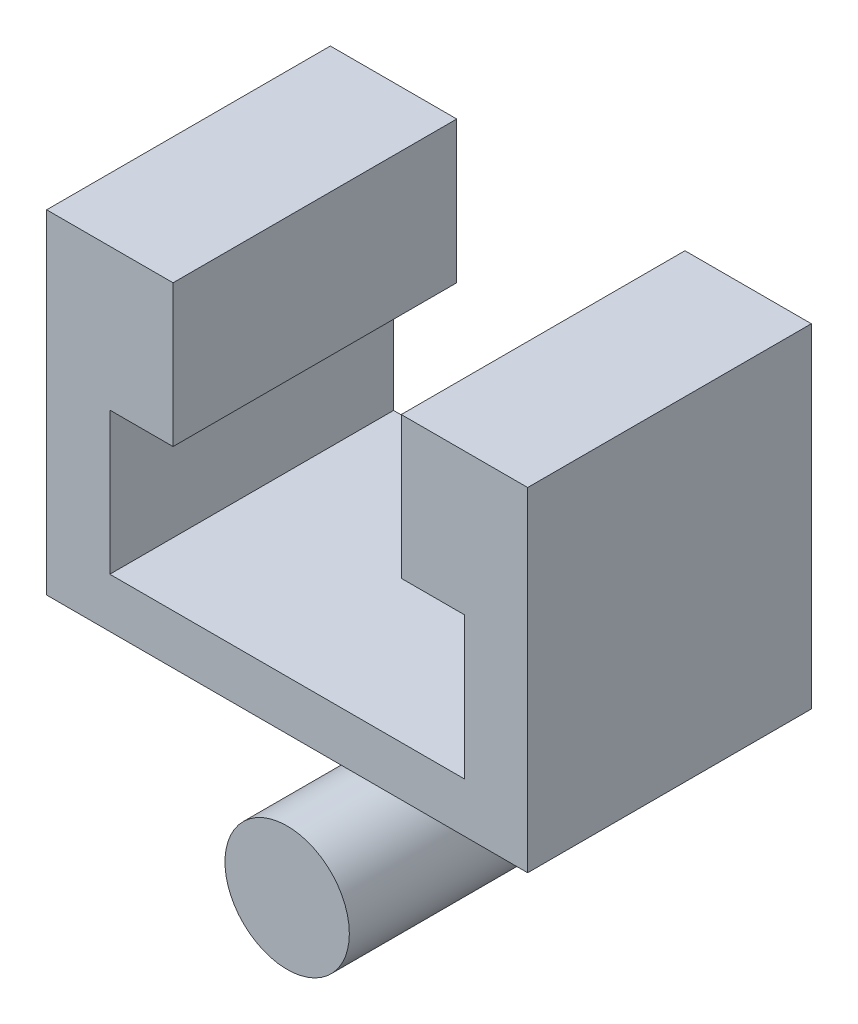
ISO-10303-21;
HEADER;
FILE_DESCRIPTION(('STEP AP214'),'2;1');
FILE_NAME('part.step','',(''),(''),'','','');
FILE_SCHEMA(('AUTOMOTIVE_DESIGN { 1 0 10303 214 1 1 1 1 }'));
ENDSEC;
DATA;
#1=APPLICATION_CONTEXT('core data for automotive mechanical design processes');
#2=APPLICATION_PROTOCOL_DEFINITION('international standard','automotive_design',2000,#1);
#3=PRODUCT_CONTEXT('',#1,'mechanical');
#4=PRODUCT('Part','Part','',(#3));
#5=PRODUCT_RELATED_PRODUCT_CATEGORY('part','',(#4));
#6=PRODUCT_DEFINITION_FORMATION('','',#4);
#7=PRODUCT_DEFINITION_CONTEXT('part definition',#1,'design');
#8=PRODUCT_DEFINITION('design','',#6,#7);
#9=PRODUCT_DEFINITION_SHAPE('','',#8);
#10=(LENGTH_UNIT() NAMED_UNIT(*) SI_UNIT(.MILLI.,.METRE.));
#11=(NAMED_UNIT(*) PLANE_ANGLE_UNIT() SI_UNIT($,.RADIAN.));
#12=(NAMED_UNIT(*) SI_UNIT($,.STERADIAN.) SOLID_ANGLE_UNIT());
#13=UNCERTAINTY_MEASURE_WITH_UNIT(LENGTH_MEASURE(1.E-05),#10,'distance_accuracy_value','');
#14=(GEOMETRIC_REPRESENTATION_CONTEXT(3) GLOBAL_UNCERTAINTY_ASSIGNED_CONTEXT((#13)) GLOBAL_UNIT_ASSIGNED_CONTEXT((#10,
#11,#12)) REPRESENTATION_CONTEXT('',''));
#15=CARTESIAN_POINT('',(0.,0.,0.));
#16=DIRECTION('',(0.,0.,1.));
#17=DIRECTION('',(1.,0.,0.));
#18=AXIS2_PLACEMENT_3D('',#15,#16,#17);
#19=CARTESIAN_POINT('',(43.0685157233723,85.1480723545712,50.8));
#20=DIRECTION('',(0.,-1.,0.));
#21=DIRECTION('',(0.,0.,-1.));
#22=AXIS2_PLACEMENT_3D('',#19,#20,#21);
#23=PLANE('',#22);
#24=DIRECTION('',(0.,0.,1.));
#25=VECTOR('',#24,1.);
#26=CARTESIAN_POINT('',(-20.4314842766277,85.1480723545712,0.));
#27=LINE('',#26,#25);
#28=CARTESIAN_POINT('',(-20.4314842766277,85.1480723545712,0.));
#29=VERTEX_POINT('',#28);
#30=CARTESIAN_POINT('',(-20.4314842766277,85.1480723545712,50.8));
#31=VERTEX_POINT('',#30);
#32=EDGE_CURVE('E169',#29,#31,#27,.T.);
#33=ORIENTED_EDGE('',*,*,#32,.F.);
#34=DIRECTION('',(-1.,0.,0.));
#35=VECTOR('',#34,1.);
#36=CARTESIAN_POINT('',(43.0685157233723,85.1480723545712,0.));
#37=LINE('',#36,#35);
#38=CARTESIAN_POINT('',(-43.0685157233723,85.1480723545712,0.));
#39=VERTEX_POINT('',#38);
#40=EDGE_CURVE('E180',#29,#39,#37,.T.);
#41=ORIENTED_EDGE('',*,*,#40,.T.);
#42=DIRECTION('',(0.,0.,-1.));
#43=VECTOR('',#42,1.);
#44=CARTESIAN_POINT('',(-43.0685157233723,85.1480723545712,50.8));
#45=LINE('',#44,#43);
#46=CARTESIAN_POINT('',(-43.0685157233723,85.1480723545712,50.8));
#47=VERTEX_POINT('',#46);
#48=EDGE_CURVE('E198',#47,#39,#45,.T.);
#49=ORIENTED_EDGE('',*,*,#48,.F.);
#50=DIRECTION('',(-1.,0.,0.));
#51=VECTOR('',#50,1.);
#52=CARTESIAN_POINT('',(43.0685157233723,85.1480723545712,50.8));
#53=LINE('',#52,#51);
#54=EDGE_CURVE('E182',#31,#47,#53,.T.);
#55=ORIENTED_EDGE('',*,*,#54,.F.);
#56=EDGE_LOOP('',(#33,#41,#49,#55));
#57=FACE_BOUND('',#56,.T.);
#58=ADVANCED_FACE('F47',(#57),#23,.F.);
#59=CARTESIAN_POINT('',(0.,0.,0.));
#60=DIRECTION('',(0.,0.,1.));
#61=DIRECTION('',(1.,0.,0.));
#62=AXIS2_PLACEMENT_3D('',#59,#60,#61);
#63=PLANE('',#62);
#64=DIRECTION('',(0.,1.,0.));
#65=VECTOR('',#64,1.);
#66=CARTESIAN_POINT('',(-20.4314842766278,59.7480723545712,0.));
#67=LINE('',#66,#65);
#68=CARTESIAN_POINT('',(-20.4314842766278,59.7480723545712,0.));
#69=VERTEX_POINT('',#68);
#70=EDGE_CURVE('E166',#69,#29,#67,.T.);
#71=ORIENTED_EDGE('',*,*,#70,.F.);
#72=DIRECTION('',(1.,0.,0.));
#73=VECTOR('',#72,1.);
#74=CARTESIAN_POINT('',(-31.75,59.7480723545712,0.));
#75=LINE('',#74,#73);
#76=CARTESIAN_POINT('',(-31.75,59.7480723545712,0.));
#77=VERTEX_POINT('',#76);
#78=EDGE_CURVE('E297',#77,#69,#75,.T.);
#79=ORIENTED_EDGE('',*,*,#78,.F.);
#80=DIRECTION('',(0.,1.,0.));
#81=VECTOR('',#80,1.);
#82=CARTESIAN_POINT('',(-31.75,34.29,0.));
#83=LINE('',#82,#81);
#84=CARTESIAN_POINT('',(-31.75,34.29,0.));
#85=VERTEX_POINT('',#84);
#86=EDGE_CURVE('E295',#85,#77,#83,.T.);
#87=ORIENTED_EDGE('',*,*,#86,.F.);
#88=DIRECTION('',(-1.,0.,0.));
#89=VECTOR('',#88,1.);
#90=CARTESIAN_POINT('',(31.75,34.29,0.));
#91=LINE('',#90,#89);
#92=CARTESIAN_POINT('',(31.75,34.29,0.));
#93=VERTEX_POINT('',#92);
#94=EDGE_CURVE('E293',#93,#85,#91,.T.);
#95=ORIENTED_EDGE('',*,*,#94,.F.);
#96=DIRECTION('',(0.,-1.,0.));
#97=VECTOR('',#96,1.);
#98=CARTESIAN_POINT('',(31.75,59.7480723545712,0.));
#99=LINE('',#98,#97);
#100=CARTESIAN_POINT('',(31.75,59.7480723545712,0.));
#101=VERTEX_POINT('',#100);
#102=EDGE_CURVE('E289',#101,#93,#99,.T.);
#103=ORIENTED_EDGE('',*,*,#102,.F.);
#104=DIRECTION('',(1.,0.,0.));
#105=VECTOR('',#104,1.);
#106=CARTESIAN_POINT('',(20.4314842766277,59.7480723545712,0.));
#107=LINE('',#106,#105);
#108=CARTESIAN_POINT('',(20.4314842766277,59.7480723545712,0.));
#109=VERTEX_POINT('',#108);
#110=EDGE_CURVE('E285',#109,#101,#107,.T.);
#111=ORIENTED_EDGE('',*,*,#110,.F.);
#112=DIRECTION('',(0.,-1.,0.));
#113=VECTOR('',#112,1.);
#114=CARTESIAN_POINT('',(20.4314842766278,85.1480723545712,0.));
#115=LINE('',#114,#113);
#116=CARTESIAN_POINT('',(20.4314842766278,85.1480723545712,0.));
#117=VERTEX_POINT('',#116);
#118=EDGE_CURVE('E174',#117,#109,#115,.T.);
#119=ORIENTED_EDGE('',*,*,#118,.F.);
#120=CARTESIAN_POINT('',(43.0685157233723,85.1480723545712,0.));
#121=VERTEX_POINT('',#120);
#122=EDGE_CURVE('E189',#121,#117,#37,.T.);
#123=ORIENTED_EDGE('',*,*,#122,.F.);
#124=DIRECTION('',(0.,1.,0.));
#125=VECTOR('',#124,1.);
#126=CARTESIAN_POINT('',(43.0685157233722,25.4,0.));
#127=LINE('',#126,#125);
#128=CARTESIAN_POINT('',(43.0685157233722,25.4,0.));
#129=VERTEX_POINT('',#128);
#130=EDGE_CURVE('E190',#129,#121,#127,.T.);
#131=ORIENTED_EDGE('',*,*,#130,.F.);
#132=DIRECTION('',(1.,0.,0.));
#133=VECTOR('',#132,1.);
#134=CARTESIAN_POINT('',(-43.0685157233722,25.4,0.));
#135=LINE('',#134,#133);
#136=CARTESIAN_POINT('',(11.1361185564172,25.4,0.));
#137=VERTEX_POINT('',#136);
#138=EDGE_CURVE('E237',#137,#129,#135,.T.);
#139=ORIENTED_EDGE('',*,*,#138,.F.);
#140=DIRECTION('',(0.,-1.,0.));
#141=VECTOR('',#140,1.);
#142=CARTESIAN_POINT('',(11.1361185564172,25.4,0.));
#143=LINE('',#142,#141);
#144=CARTESIAN_POINT('',(11.1361185564172,0.,0.));
#145=VERTEX_POINT('',#144);
#146=EDGE_CURVE('E214',#137,#145,#143,.T.);
#147=ORIENTED_EDGE('',*,*,#146,.T.);
#148=CARTESIAN_POINT('',(0.,0.,0.));
#149=DIRECTION('',(0.,0.,1.));
#150=DIRECTION('',(1.,0.,0.));
#151=AXIS2_PLACEMENT_3D('',#148,#149,#150);
#152=CIRCLE('',#151,11.1361185564172);
#153=CARTESIAN_POINT('',(-11.1361185564172,0.,0.));
#154=VERTEX_POINT('',#153);
#155=EDGE_CURVE('E210',#154,#145,#152,.T.);
#156=ORIENTED_EDGE('',*,*,#155,.F.);
#157=DIRECTION('',(0.,1.,0.));
#158=VECTOR('',#157,1.);
#159=CARTESIAN_POINT('',(-11.1361185564172,0.,0.));
#160=LINE('',#159,#158);
#161=CARTESIAN_POINT('',(-11.1361185564172,25.4,0.));
#162=VERTEX_POINT('',#161);
#163=EDGE_CURVE('E219',#154,#162,#160,.T.);
#164=ORIENTED_EDGE('',*,*,#163,.T.);
#165=CARTESIAN_POINT('',(-43.0685157233722,25.4,0.));
#166=VERTEX_POINT('',#165);
#167=EDGE_CURVE('E194',#166,#162,#135,.T.);
#168=ORIENTED_EDGE('',*,*,#167,.F.);
#169=DIRECTION('',(0.,-1.,0.));
#170=VECTOR('',#169,1.);
#171=CARTESIAN_POINT('',(-43.0685157233723,85.1480723545712,0.));
#172=LINE('',#171,#170);
#173=EDGE_CURVE('E183',#39,#166,#172,.T.);
#174=ORIENTED_EDGE('',*,*,#173,.F.);
#175=ORIENTED_EDGE('',*,*,#40,.F.);
#176=EDGE_LOOP('',(#71,#79,#87,#95,#103,#111,#119,#123,#131,#139,#147,#156,#164,#168,#174,#175));
#177=FACE_BOUND('',#176,.T.);
#178=ADVANCED_FACE('F187',(#177),#63,.F.);
#179=CARTESIAN_POINT('',(0.,0.,50.8));
#180=DIRECTION('',(0.,0.,1.));
#181=DIRECTION('',(1.,0.,0.));
#182=AXIS2_PLACEMENT_3D('',#179,#180,#181);
#183=PLANE('',#182);
#184=DIRECTION('',(1.,0.,0.));
#185=VECTOR('',#184,1.);
#186=CARTESIAN_POINT('',(-31.75,59.7480723545712,50.8));
#187=LINE('',#186,#185);
#188=CARTESIAN_POINT('',(-31.75,59.7480723545712,50.8));
#189=VERTEX_POINT('',#188);
#190=CARTESIAN_POINT('',(-20.4314842766278,59.7480723545712,50.8));
#191=VERTEX_POINT('',#190);
#192=EDGE_CURVE('E175',#189,#191,#187,.T.);
#193=ORIENTED_EDGE('',*,*,#192,.T.);
#194=DIRECTION('',(0.,1.,0.));
#195=VECTOR('',#194,1.);
#196=CARTESIAN_POINT('',(-20.4314842766278,59.7480723545712,50.8));
#197=LINE('',#196,#195);
#198=EDGE_CURVE('E64',#191,#31,#197,.T.);
#199=ORIENTED_EDGE('',*,*,#198,.T.);
#200=ORIENTED_EDGE('',*,*,#54,.T.);
#201=DIRECTION('',(0.,-1.,0.));
#202=VECTOR('',#201,1.);
#203=CARTESIAN_POINT('',(-43.0685157233723,85.1480723545712,50.8));
#204=LINE('',#203,#202);
#205=CARTESIAN_POINT('',(-43.0685157233722,25.4,50.8));
#206=VERTEX_POINT('',#205);
#207=EDGE_CURVE('E193',#47,#206,#204,.T.);
#208=ORIENTED_EDGE('',*,*,#207,.T.);
#209=DIRECTION('',(1.,0.,0.));
#210=VECTOR('',#209,1.);
#211=CARTESIAN_POINT('',(-43.0685157233722,25.4,50.8));
#212=LINE('',#211,#210);
#213=CARTESIAN_POINT('',(43.0685157233722,25.4,50.8));
#214=VERTEX_POINT('',#213);
#215=EDGE_CURVE('E331',#206,#214,#212,.T.);
#216=ORIENTED_EDGE('',*,*,#215,.T.);
#217=DIRECTION('',(0.,1.,0.));
#218=VECTOR('',#217,1.);
#219=CARTESIAN_POINT('',(43.0685157233722,25.4,50.8));
#220=LINE('',#219,#218);
#221=CARTESIAN_POINT('',(43.0685157233723,85.1480723545712,50.8));
#222=VERTEX_POINT('',#221);
#223=EDGE_CURVE('E333',#214,#222,#220,.T.);
#224=ORIENTED_EDGE('',*,*,#223,.T.);
#225=CARTESIAN_POINT('',(20.4314842766278,85.1480723545712,50.8));
#226=VERTEX_POINT('',#225);
#227=EDGE_CURVE('E201',#222,#226,#53,.T.);
#228=ORIENTED_EDGE('',*,*,#227,.T.);
#229=DIRECTION('',(0.,-1.,0.));
#230=VECTOR('',#229,1.);
#231=CARTESIAN_POINT('',(20.4314842766278,85.1480723545712,50.8));
#232=LINE('',#231,#230);
#233=CARTESIAN_POINT('',(20.4314842766277,59.7480723545712,50.8));
#234=VERTEX_POINT('',#233);
#235=EDGE_CURVE('E300',#226,#234,#232,.T.);
#236=ORIENTED_EDGE('',*,*,#235,.T.);
#237=DIRECTION('',(1.,0.,0.));
#238=VECTOR('',#237,1.);
#239=CARTESIAN_POINT('',(20.4314842766277,59.7480723545712,50.8));
#240=LINE('',#239,#238);
#241=CARTESIAN_POINT('',(31.75,59.7480723545712,50.8));
#242=VERTEX_POINT('',#241);
#243=EDGE_CURVE('E303',#234,#242,#240,.T.);
#244=ORIENTED_EDGE('',*,*,#243,.T.);
#245=DIRECTION('',(0.,-1.,0.));
#246=VECTOR('',#245,1.);
#247=CARTESIAN_POINT('',(31.75,59.7480723545712,50.8));
#248=LINE('',#247,#246);
#249=CARTESIAN_POINT('',(31.75,34.29,50.8));
#250=VERTEX_POINT('',#249);
#251=EDGE_CURVE('E306',#242,#250,#248,.T.);
#252=ORIENTED_EDGE('',*,*,#251,.T.);
#253=DIRECTION('',(-1.,0.,0.));
#254=VECTOR('',#253,1.);
#255=CARTESIAN_POINT('',(31.75,34.29,50.8));
#256=LINE('',#255,#254);
#257=CARTESIAN_POINT('',(-31.75,34.29,50.8));
#258=VERTEX_POINT('',#257);
#259=EDGE_CURVE('E309',#250,#258,#256,.T.);
#260=ORIENTED_EDGE('',*,*,#259,.T.);
#261=DIRECTION('',(0.,1.,0.));
#262=VECTOR('',#261,1.);
#263=CARTESIAN_POINT('',(-31.75,34.29,50.8));
#264=LINE('',#263,#262);
#265=EDGE_CURVE('E312',#258,#189,#264,.T.);
#266=ORIENTED_EDGE('',*,*,#265,.T.);
#267=EDGE_LOOP('',(#193,#199,#200,#208,#216,#224,#228,#236,#244,#252,#260,#266));
#268=FACE_BOUND('',#267,.T.);
#269=ADVANCED_FACE('F261',(#268),#183,.T.);
#270=CARTESIAN_POINT('',(11.1361185564172,25.4,0.840608911943736));
#271=DIRECTION('',(1.,0.,0.));
#272=DIRECTION('',(0.,1.,0.));
#273=AXIS2_PLACEMENT_3D('',#270,#271,#272);
#274=PLANE('',#273);
#275=ORIENTED_EDGE('',*,*,#146,.F.);
#276=DIRECTION('',(0.,0.,-1.));
#277=VECTOR('',#276,1.);
#278=CARTESIAN_POINT('',(11.1361185564172,25.4,0.840608911943736));
#279=LINE('',#278,#277);
#280=CARTESIAN_POINT('',(11.1361185564172,25.4,0.840608911943736));
#281=VERTEX_POINT('',#280);
#282=EDGE_CURVE('E11',#281,#137,#279,.T.);
#283=ORIENTED_EDGE('',*,*,#282,.F.);
#284=DIRECTION('',(0.,-1.,0.));
#285=VECTOR('',#284,1.);
#286=CARTESIAN_POINT('',(11.1361185564172,25.4,0.840608911943736));
#287=LINE('',#286,#285);
#288=CARTESIAN_POINT('',(11.1361185564172,0.,0.840608911943736));
#289=VERTEX_POINT('',#288);
#290=EDGE_CURVE('E217',#281,#289,#287,.T.);
#291=ORIENTED_EDGE('',*,*,#290,.T.);
#292=DIRECTION('',(0.,0.,-1.));
#293=VECTOR('',#292,1.);
#294=CARTESIAN_POINT('',(11.1361185564172,0.,0.840608911943736));
#295=LINE('',#294,#293);
#296=EDGE_CURVE('E51',#289,#145,#295,.T.);
#297=ORIENTED_EDGE('',*,*,#296,.T.);
#298=EDGE_LOOP('',(#275,#283,#291,#297));
#299=FACE_BOUND('',#298,.T.);
#300=ADVANCED_FACE('F49',(#299),#274,.T.);
#301=CARTESIAN_POINT('',(-11.1361185564172,0.,0.840608911943736));
#302=DIRECTION('',(-1.,0.,0.));
#303=DIRECTION('',(0.,-1.,0.));
#304=AXIS2_PLACEMENT_3D('',#301,#302,#303);
#305=PLANE('',#304);
#306=ORIENTED_EDGE('',*,*,#163,.F.);
#307=DIRECTION('',(0.,0.,-1.));
#308=VECTOR('',#307,1.);
#309=CARTESIAN_POINT('',(-11.1361185564172,0.,0.840608911943736));
#310=LINE('',#309,#308);
#311=CARTESIAN_POINT('',(-11.1361185564172,0.,0.840608911943735));
#312=VERTEX_POINT('',#311);
#313=EDGE_CURVE('E229',#312,#154,#310,.T.);
#314=ORIENTED_EDGE('',*,*,#313,.F.);
#315=DIRECTION('',(0.,1.,0.));
#316=VECTOR('',#315,1.);
#317=CARTESIAN_POINT('',(-11.1361185564172,0.,0.840608911943736));
#318=LINE('',#317,#316);
#319=CARTESIAN_POINT('',(-11.1361185564172,25.4,0.840608911943736));
#320=VERTEX_POINT('',#319);
#321=EDGE_CURVE('E221',#312,#320,#318,.T.);
#322=ORIENTED_EDGE('',*,*,#321,.T.);
#323=DIRECTION('',(0.,0.,-1.));
#324=VECTOR('',#323,1.);
#325=CARTESIAN_POINT('',(-11.1361185564172,25.4,0.840608911943736));
#326=LINE('',#325,#324);
#327=EDGE_CURVE('E56',#320,#162,#326,.T.);
#328=ORIENTED_EDGE('',*,*,#327,.T.);
#329=EDGE_LOOP('',(#306,#314,#322,#328));
#330=FACE_BOUND('',#329,.T.);
#331=ADVANCED_FACE('F374',(#330),#305,.T.);
#332=CARTESIAN_POINT('',(0.,0.,0.840608911943736));
#333=DIRECTION('',(0.,0.,1.));
#334=DIRECTION('',(1.,0.,0.));
#335=AXIS2_PLACEMENT_3D('',#332,#333,#334);
#336=PLANE('',#335);
#337=ORIENTED_EDGE('',*,*,#290,.F.);
#338=DIRECTION('',(1.,0.,0.));
#339=VECTOR('',#338,1.);
#340=CARTESIAN_POINT('',(-11.1361185564172,25.4,0.840608911943736));
#341=LINE('',#340,#339);
#342=EDGE_CURVE('E223',#320,#281,#341,.T.);
#343=ORIENTED_EDGE('',*,*,#342,.F.);
#344=ORIENTED_EDGE('',*,*,#321,.F.);
#345=CARTESIAN_POINT('',(0.,0.,0.840608911943736));
#346=DIRECTION('',(0.,0.,1.));
#347=DIRECTION('',(1.,0.,0.));
#348=AXIS2_PLACEMENT_3D('',#345,#346,#347);
#349=CIRCLE('',#348,11.1361185564172);
#350=EDGE_CURVE('E93',#289,#312,#349,.T.);
#351=ORIENTED_EDGE('',*,*,#350,.F.);
#352=EDGE_LOOP('',(#337,#343,#344,#351));
#353=FACE_BOUND('',#352,.T.);
#354=ADVANCED_FACE('F242',(#353),#336,.T.);
#355=CARTESIAN_POINT('',(0.,0.,50.8));
#356=DIRECTION('',(0.,0.,-1.));
#357=DIRECTION('',(-1.,0.,0.));
#358=AXIS2_PLACEMENT_3D('',#355,#356,#357);
#359=CYLINDRICAL_SURFACE('',#358,11.1361185564172);
#360=ORIENTED_EDGE('',*,*,#296,.F.);
#361=ORIENTED_EDGE('',*,*,#350,.T.);
#362=ORIENTED_EDGE('',*,*,#313,.T.);
#363=ORIENTED_EDGE('',*,*,#155,.T.);
#364=EDGE_LOOP('',(#360,#361,#362,#363));
#365=FACE_BOUND('',#364,.T.);
#366=CARTESIAN_POINT('',(0.,0.,50.8));
#367=DIRECTION('',(0.,0.,1.));
#368=DIRECTION('',(1.,0.,0.));
#369=AXIS2_PLACEMENT_3D('',#366,#367,#368);
#370=CIRCLE('',#369,11.1361185564172);
#371=CARTESIAN_POINT('',(11.1361185564172,0.,50.8));
#372=VERTEX_POINT('',#371);
#373=EDGE_CURVE('E211',#372,#372,#370,.T.);
#374=ORIENTED_EDGE('',*,*,#373,.F.);
#375=EDGE_LOOP('',(#374));
#376=FACE_BOUND('',#375,.T.);
#377=ADVANCED_FACE('F238',(#365,#376),#359,.T.);
#378=CARTESIAN_POINT('',(0.,0.,50.8));
#379=DIRECTION('',(0.,0.,1.));
#380=DIRECTION('',(1.,0.,0.));
#381=AXIS2_PLACEMENT_3D('',#378,#379,#380);
#382=PLANE('',#381);
#383=ORIENTED_EDGE('',*,*,#373,.T.);
#384=EDGE_LOOP('',(#383));
#385=FACE_BOUND('',#384,.T.);
#386=ADVANCED_FACE('F241',(#385),#382,.T.);
#387=CARTESIAN_POINT('',(-43.0685157233723,85.1480723545712,50.8));
#388=DIRECTION('',(1.,0.,0.));
#389=DIRECTION('',(0.,1.,0.));
#390=AXIS2_PLACEMENT_3D('',#387,#388,#389);
#391=PLANE('',#390);
#392=ORIENTED_EDGE('',*,*,#173,.T.);
#393=DIRECTION('',(0.,0.,-1.));
#394=VECTOR('',#393,1.);
#395=CARTESIAN_POINT('',(-43.0685157233722,25.4,50.8));
#396=LINE('',#395,#394);
#397=EDGE_CURVE('E207',#206,#166,#396,.T.);
#398=ORIENTED_EDGE('',*,*,#397,.F.);
#399=ORIENTED_EDGE('',*,*,#207,.F.);
#400=ORIENTED_EDGE('',*,*,#48,.T.);
#401=EDGE_LOOP('',(#392,#398,#399,#400));
#402=FACE_BOUND('',#401,.T.);
#403=ADVANCED_FACE('F247',(#402),#391,.F.);
#404=CARTESIAN_POINT('',(-43.0685157233722,25.4,50.8));
#405=DIRECTION('',(0.,1.,0.));
#406=DIRECTION('',(0.,0.,1.));
#407=AXIS2_PLACEMENT_3D('',#404,#405,#406);
#408=PLANE('',#407);
#409=ORIENTED_EDGE('',*,*,#327,.F.);
#410=ORIENTED_EDGE('',*,*,#342,.T.);
#411=ORIENTED_EDGE('',*,*,#282,.T.);
#412=ORIENTED_EDGE('',*,*,#138,.T.);
#413=DIRECTION('',(0.,0.,-1.));
#414=VECTOR('',#413,1.);
#415=CARTESIAN_POINT('',(43.0685157233722,25.4,50.8));
#416=LINE('',#415,#414);
#417=EDGE_CURVE('E204',#214,#129,#416,.T.);
#418=ORIENTED_EDGE('',*,*,#417,.F.);
#419=ORIENTED_EDGE('',*,*,#215,.F.);
#420=ORIENTED_EDGE('',*,*,#397,.T.);
#421=ORIENTED_EDGE('',*,*,#167,.T.);
#422=EDGE_LOOP('',(#409,#410,#411,#412,#418,#419,#420,#421));
#423=FACE_BOUND('',#422,.T.);
#424=ADVANCED_FACE('F251',(#423),#408,.F.);
#425=CARTESIAN_POINT('',(43.0685157233722,25.4,50.8));
#426=DIRECTION('',(-1.,0.,0.));
#427=DIRECTION('',(0.,-1.,0.));
#428=AXIS2_PLACEMENT_3D('',#425,#426,#427);
#429=PLANE('',#428);
#430=ORIENTED_EDGE('',*,*,#130,.T.);
#431=DIRECTION('',(0.,0.,-1.));
#432=VECTOR('',#431,1.);
#433=CARTESIAN_POINT('',(43.0685157233723,85.1480723545712,50.8));
#434=LINE('',#433,#432);
#435=EDGE_CURVE('E200',#222,#121,#434,.T.);
#436=ORIENTED_EDGE('',*,*,#435,.F.);
#437=ORIENTED_EDGE('',*,*,#223,.F.);
#438=ORIENTED_EDGE('',*,*,#417,.T.);
#439=EDGE_LOOP('',(#430,#436,#437,#438));
#440=FACE_BOUND('',#439,.T.);
#441=ADVANCED_FACE('F266',(#440),#429,.F.);
#442=ORIENTED_EDGE('',*,*,#122,.T.);
#443=DIRECTION('',(0.,0.,1.));
#444=VECTOR('',#443,1.);
#445=CARTESIAN_POINT('',(20.4314842766278,85.1480723545712,0.));
#446=LINE('',#445,#444);
#447=EDGE_CURVE('E184',#117,#226,#446,.T.);
#448=ORIENTED_EDGE('',*,*,#447,.T.);
#449=ORIENTED_EDGE('',*,*,#227,.F.);
#450=ORIENTED_EDGE('',*,*,#435,.T.);
#451=EDGE_LOOP('',(#442,#448,#449,#450));
#452=FACE_BOUND('',#451,.T.);
#453=ADVANCED_FACE('F256',(#452),#23,.F.);
#454=CARTESIAN_POINT('',(-20.4314842766278,59.7480723545712,0.));
#455=DIRECTION('',(1.,0.,0.));
#456=DIRECTION('',(0.,1.,0.));
#457=AXIS2_PLACEMENT_3D('',#454,#455,#456);
#458=PLANE('',#457);
#459=ORIENTED_EDGE('',*,*,#198,.F.);
#460=DIRECTION('',(0.,0.,1.));
#461=VECTOR('',#460,1.);
#462=CARTESIAN_POINT('',(-20.4314842766278,59.7480723545712,0.));
#463=LINE('',#462,#461);
#464=EDGE_CURVE('E170',#69,#191,#463,.T.);
#465=ORIENTED_EDGE('',*,*,#464,.F.);
#466=ORIENTED_EDGE('',*,*,#70,.T.);
#467=ORIENTED_EDGE('',*,*,#32,.T.);
#468=EDGE_LOOP('',(#459,#465,#466,#467));
#469=FACE_BOUND('',#468,.T.);
#470=ADVANCED_FACE('F168',(#469),#458,.T.);
#471=CARTESIAN_POINT('',(20.4314842766278,85.1480723545712,0.));
#472=DIRECTION('',(-1.,0.,0.));
#473=DIRECTION('',(0.,-1.,0.));
#474=AXIS2_PLACEMENT_3D('',#471,#472,#473);
#475=PLANE('',#474);
#476=ORIENTED_EDGE('',*,*,#235,.F.);
#477=ORIENTED_EDGE('',*,*,#447,.F.);
#478=ORIENTED_EDGE('',*,*,#118,.T.);
#479=DIRECTION('',(0.,0.,1.));
#480=VECTOR('',#479,1.);
#481=CARTESIAN_POINT('',(20.4314842766277,59.7480723545712,0.));
#482=LINE('',#481,#480);
#483=EDGE_CURVE('E326',#109,#234,#482,.T.);
#484=ORIENTED_EDGE('',*,*,#483,.T.);
#485=EDGE_LOOP('',(#476,#477,#478,#484));
#486=FACE_BOUND('',#485,.T.);
#487=ADVANCED_FACE('F273',(#486),#475,.T.);
#488=CARTESIAN_POINT('',(20.4314842766277,59.7480723545712,0.));
#489=DIRECTION('',(0.,-1.,0.));
#490=DIRECTION('',(0.,0.,-1.));
#491=AXIS2_PLACEMENT_3D('',#488,#489,#490);
#492=PLANE('',#491);
#493=ORIENTED_EDGE('',*,*,#243,.F.);
#494=ORIENTED_EDGE('',*,*,#483,.F.);
#495=ORIENTED_EDGE('',*,*,#110,.T.);
#496=DIRECTION('',(0.,0.,1.));
#497=VECTOR('',#496,1.);
#498=CARTESIAN_POINT('',(31.75,59.7480723545712,0.));
#499=LINE('',#498,#497);
#500=EDGE_CURVE('E324',#101,#242,#499,.T.);
#501=ORIENTED_EDGE('',*,*,#500,.T.);
#502=EDGE_LOOP('',(#493,#494,#495,#501));
#503=FACE_BOUND('',#502,.T.);
#504=ADVANCED_FACE('F363',(#503),#492,.T.);
#505=CARTESIAN_POINT('',(31.75,59.7480723545712,0.));
#506=DIRECTION('',(-1.,0.,0.));
#507=DIRECTION('',(0.,-1.,0.));
#508=AXIS2_PLACEMENT_3D('',#505,#506,#507);
#509=PLANE('',#508);
#510=ORIENTED_EDGE('',*,*,#251,.F.);
#511=ORIENTED_EDGE('',*,*,#500,.F.);
#512=ORIENTED_EDGE('',*,*,#102,.T.);
#513=DIRECTION('',(0.,0.,1.));
#514=VECTOR('',#513,1.);
#515=CARTESIAN_POINT('',(31.75,34.29,0.));
#516=LINE('',#515,#514);
#517=EDGE_CURVE('E322',#93,#250,#516,.T.);
#518=ORIENTED_EDGE('',*,*,#517,.T.);
#519=EDGE_LOOP('',(#510,#511,#512,#518));
#520=FACE_BOUND('',#519,.T.);
#521=ADVANCED_FACE('F359',(#520),#509,.T.);
#522=CARTESIAN_POINT('',(31.75,34.29,0.));
#523=DIRECTION('',(0.,1.,0.));
#524=DIRECTION('',(-1.,0.,0.));
#525=AXIS2_PLACEMENT_3D('',#522,#523,#524);
#526=PLANE('',#525);
#527=ORIENTED_EDGE('',*,*,#259,.F.);
#528=ORIENTED_EDGE('',*,*,#517,.F.);
#529=ORIENTED_EDGE('',*,*,#94,.T.);
#530=DIRECTION('',(0.,0.,1.));
#531=VECTOR('',#530,1.);
#532=CARTESIAN_POINT('',(-31.75,34.29,0.));
#533=LINE('',#532,#531);
#534=EDGE_CURVE('E320',#85,#258,#533,.T.);
#535=ORIENTED_EDGE('',*,*,#534,.T.);
#536=EDGE_LOOP('',(#527,#528,#529,#535));
#537=FACE_BOUND('',#536,.T.);
#538=ADVANCED_FACE('F355',(#537),#526,.T.);
#539=CARTESIAN_POINT('',(-31.75,34.29,0.));
#540=DIRECTION('',(1.,0.,0.));
#541=DIRECTION('',(0.,0.,-1.));
#542=AXIS2_PLACEMENT_3D('',#539,#540,#541);
#543=PLANE('',#542);
#544=ORIENTED_EDGE('',*,*,#265,.F.);
#545=ORIENTED_EDGE('',*,*,#534,.F.);
#546=ORIENTED_EDGE('',*,*,#86,.T.);
#547=DIRECTION('',(0.,0.,1.));
#548=VECTOR('',#547,1.);
#549=CARTESIAN_POINT('',(-31.75,59.7480723545712,0.));
#550=LINE('',#549,#548);
#551=EDGE_CURVE('E318',#77,#189,#550,.T.);
#552=ORIENTED_EDGE('',*,*,#551,.T.);
#553=EDGE_LOOP('',(#544,#545,#546,#552));
#554=FACE_BOUND('',#553,.T.);
#555=ADVANCED_FACE('F352',(#554),#543,.T.);
#556=CARTESIAN_POINT('',(-31.75,59.7480723545712,0.));
#557=DIRECTION('',(0.,-1.,0.));
#558=DIRECTION('',(0.,0.,-1.));
#559=AXIS2_PLACEMENT_3D('',#556,#557,#558);
#560=PLANE('',#559);
#561=ORIENTED_EDGE('',*,*,#192,.F.);
#562=ORIENTED_EDGE('',*,*,#551,.F.);
#563=ORIENTED_EDGE('',*,*,#78,.T.);
#564=ORIENTED_EDGE('',*,*,#464,.T.);
#565=EDGE_LOOP('',(#561,#562,#563,#564));
#566=FACE_BOUND('',#565,.T.);
#567=ADVANCED_FACE('F347',(#566),#560,.T.);
#568=CLOSED_SHELL('',(#58,#178,#269,#300,#331,#354,#377,#386,#403,#424,#441,#453,#470,#487,#504,
#521,#538,#555,#567));
#569=MANIFOLD_SOLID_BREP('B2',#568);
#570=ADVANCED_BREP_SHAPE_REPRESENTATION('',(#18,#569),#14);
#571=SHAPE_DEFINITION_REPRESENTATION(#9,#570);
ENDSEC;
END-ISO-10303-21;
